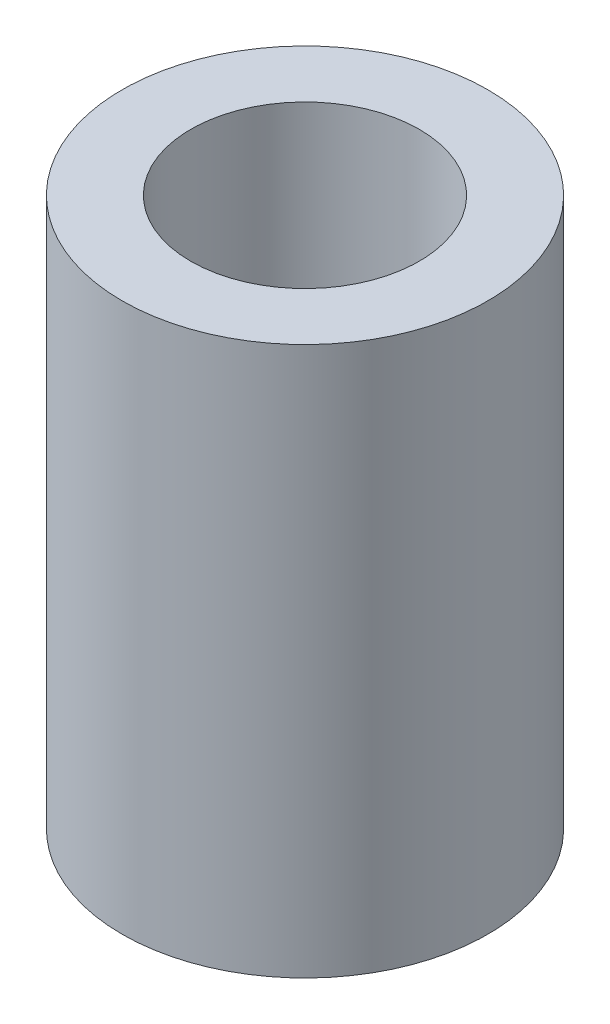
ISO-10303-21;
HEADER;
FILE_DESCRIPTION(('STEP AP214'),'2;1');
FILE_NAME('part.step','',(''),(''),'','','');
FILE_SCHEMA(('AUTOMOTIVE_DESIGN { 1 0 10303 214 1 1 1 1 }'));
ENDSEC;
DATA;
#1=APPLICATION_CONTEXT('core data for automotive mechanical design processes');
#2=APPLICATION_PROTOCOL_DEFINITION('international standard','automotive_design',2000,#1);
#3=PRODUCT_CONTEXT('',#1,'mechanical');
#4=PRODUCT('Part','Part','',(#3));
#5=PRODUCT_RELATED_PRODUCT_CATEGORY('part','',(#4));
#6=PRODUCT_DEFINITION_FORMATION('','',#4);
#7=PRODUCT_DEFINITION_CONTEXT('part definition',#1,'design');
#8=PRODUCT_DEFINITION('design','',#6,#7);
#9=PRODUCT_DEFINITION_SHAPE('','',#8);
#10=(LENGTH_UNIT() NAMED_UNIT(*) SI_UNIT(.MILLI.,.METRE.));
#11=(NAMED_UNIT(*) PLANE_ANGLE_UNIT() SI_UNIT($,.RADIAN.));
#12=(NAMED_UNIT(*) SI_UNIT($,.STERADIAN.) SOLID_ANGLE_UNIT());
#13=UNCERTAINTY_MEASURE_WITH_UNIT(LENGTH_MEASURE(1.E-05),#10,'distance_accuracy_value','');
#14=(GEOMETRIC_REPRESENTATION_CONTEXT(3) GLOBAL_UNCERTAINTY_ASSIGNED_CONTEXT((#13)) GLOBAL_UNIT_ASSIGNED_CONTEXT((#10,
#11,#12)) REPRESENTATION_CONTEXT('',''));
#15=CARTESIAN_POINT('',(0.,0.,0.));
#16=DIRECTION('',(0.,0.,1.));
#17=DIRECTION('',(1.,0.,0.));
#18=AXIS2_PLACEMENT_3D('',#15,#16,#17);
#19=CARTESIAN_POINT('',(0.,24.,0.));
#20=DIRECTION('',(0.,1.,0.));
#21=DIRECTION('',(0.,0.,1.));
#22=AXIS2_PLACEMENT_3D('',#19,#20,#21);
#23=PLANE('',#22);
#24=CARTESIAN_POINT('',(0.,24.,0.));
#25=DIRECTION('',(0.,1.,0.));
#26=DIRECTION('',(0.,0.,1.));
#27=AXIS2_PLACEMENT_3D('',#24,#25,#26);
#28=CIRCLE('',#27,8.);
#29=CARTESIAN_POINT('',(0.,24.,8.));
#30=VERTEX_POINT('',#29);
#31=EDGE_CURVE('E10',#30,#30,#28,.T.);
#32=ORIENTED_EDGE('',*,*,#31,.T.);
#33=EDGE_LOOP('',(#32));
#34=FACE_BOUND('',#33,.T.);
#35=CARTESIAN_POINT('',(0.,24.,0.));
#36=DIRECTION('',(0.,1.,0.));
#37=DIRECTION('',(0.,0.,1.));
#38=AXIS2_PLACEMENT_3D('',#35,#36,#37);
#39=CIRCLE('',#38,5.);
#40=CARTESIAN_POINT('',(0.,24.,5.));
#41=VERTEX_POINT('',#40);
#42=EDGE_CURVE('E49',#41,#41,#39,.T.);
#43=ORIENTED_EDGE('',*,*,#42,.F.);
#44=EDGE_LOOP('',(#43));
#45=FACE_BOUND('',#44,.T.);
#46=ADVANCED_FACE('F39',(#34,#45),#23,.T.);
#47=CARTESIAN_POINT('',(0.,0.,0.));
#48=DIRECTION('',(0.,1.,0.));
#49=DIRECTION('',(0.,0.,1.));
#50=AXIS2_PLACEMENT_3D('',#47,#48,#49);
#51=PLANE('',#50);
#52=CARTESIAN_POINT('',(0.,0.,0.));
#53=DIRECTION('',(0.,1.,0.));
#54=DIRECTION('',(0.,0.,1.));
#55=AXIS2_PLACEMENT_3D('',#52,#53,#54);
#56=CIRCLE('',#55,8.);
#57=CARTESIAN_POINT('',(0.,0.,8.));
#58=VERTEX_POINT('',#57);
#59=EDGE_CURVE('E43',#58,#58,#56,.T.);
#60=ORIENTED_EDGE('',*,*,#59,.F.);
#61=EDGE_LOOP('',(#60));
#62=FACE_BOUND('',#61,.T.);
#63=CARTESIAN_POINT('',(0.,0.,0.));
#64=DIRECTION('',(0.,1.,0.));
#65=DIRECTION('',(0.,0.,1.));
#66=AXIS2_PLACEMENT_3D('',#63,#64,#65);
#67=CIRCLE('',#66,5.);
#68=CARTESIAN_POINT('',(0.,0.,5.));
#69=VERTEX_POINT('',#68);
#70=EDGE_CURVE('E55',#69,#69,#67,.T.);
#71=ORIENTED_EDGE('',*,*,#70,.T.);
#72=EDGE_LOOP('',(#71));
#73=FACE_BOUND('',#72,.T.);
#74=ADVANCED_FACE('F62',(#62,#73),#51,.F.);
#75=CARTESIAN_POINT('',(0.,24.,0.));
#76=DIRECTION('',(0.,-1.,0.));
#77=DIRECTION('',(0.,0.,-1.));
#78=AXIS2_PLACEMENT_3D('',#75,#76,#77);
#79=CYLINDRICAL_SURFACE('',#78,8.);
#80=ORIENTED_EDGE('',*,*,#31,.F.);
#81=EDGE_LOOP('',(#80));
#82=FACE_BOUND('',#81,.T.);
#83=ORIENTED_EDGE('',*,*,#59,.T.);
#84=EDGE_LOOP('',(#83));
#85=FACE_BOUND('',#84,.T.);
#86=ADVANCED_FACE('F41',(#82,#85),#79,.T.);
#87=CARTESIAN_POINT('',(0.,24.,0.));
#88=DIRECTION('',(0.,-1.,0.));
#89=DIRECTION('',(0.,0.,-1.));
#90=AXIS2_PLACEMENT_3D('',#87,#88,#89);
#91=CYLINDRICAL_SURFACE('',#90,5.);
#92=ORIENTED_EDGE('',*,*,#42,.T.);
#93=EDGE_LOOP('',(#92));
#94=FACE_BOUND('',#93,.T.);
#95=ORIENTED_EDGE('',*,*,#70,.F.);
#96=EDGE_LOOP('',(#95));
#97=FACE_BOUND('',#96,.T.);
#98=ADVANCED_FACE('F59',(#94,#97),#91,.F.);
#99=CLOSED_SHELL('',(#46,#74,#86,#98));
#100=MANIFOLD_SOLID_BREP('B2',#99);
#101=ADVANCED_BREP_SHAPE_REPRESENTATION('',(#18,#100),#14);
#102=SHAPE_DEFINITION_REPRESENTATION(#9,#101);
ENDSEC;
END-ISO-10303-21;
